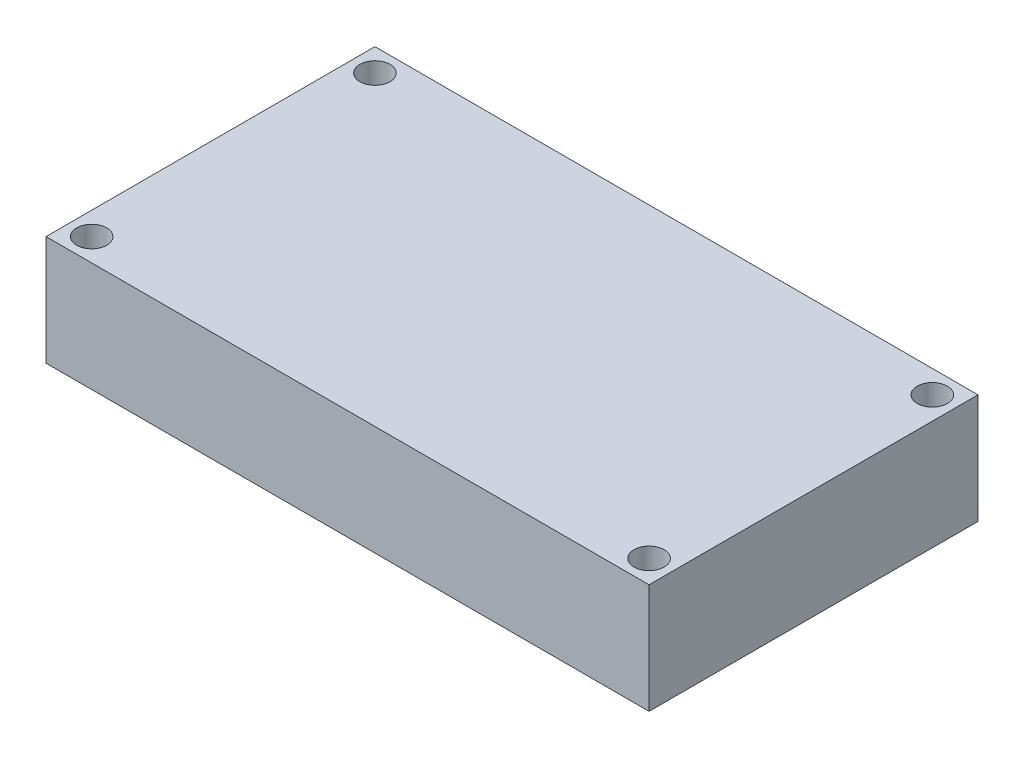
ISO-10303-21;
HEADER;
FILE_DESCRIPTION(('STEP AP214'),'2;1');
FILE_NAME('part.step','',(''),(''),'','','');
FILE_SCHEMA(('AUTOMOTIVE_DESIGN { 1 0 10303 214 1 1 1 1 }'));
ENDSEC;
DATA;
#1=APPLICATION_CONTEXT('core data for automotive mechanical design processes');
#2=APPLICATION_PROTOCOL_DEFINITION('international standard','automotive_design',2000,#1);
#3=PRODUCT_CONTEXT('',#1,'mechanical');
#4=PRODUCT('Part','Part','',(#3));
#5=PRODUCT_RELATED_PRODUCT_CATEGORY('part','',(#4));
#6=PRODUCT_DEFINITION_FORMATION('','',#4);
#7=PRODUCT_DEFINITION_CONTEXT('part definition',#1,'design');
#8=PRODUCT_DEFINITION('design','',#6,#7);
#9=PRODUCT_DEFINITION_SHAPE('','',#8);
#10=(LENGTH_UNIT() NAMED_UNIT(*) SI_UNIT(.MILLI.,.METRE.));
#11=(NAMED_UNIT(*) PLANE_ANGLE_UNIT() SI_UNIT($,.RADIAN.));
#12=(NAMED_UNIT(*) SI_UNIT($,.STERADIAN.) SOLID_ANGLE_UNIT());
#13=UNCERTAINTY_MEASURE_WITH_UNIT(LENGTH_MEASURE(1.E-05),#10,'distance_accuracy_value','');
#14=(GEOMETRIC_REPRESENTATION_CONTEXT(3) GLOBAL_UNCERTAINTY_ASSIGNED_CONTEXT((#13)) GLOBAL_UNIT_ASSIGNED_CONTEXT((#10,
#11,#12)) REPRESENTATION_CONTEXT('',''));
#15=CARTESIAN_POINT('',(0.,0.,0.));
#16=DIRECTION('',(0.,0.,1.));
#17=DIRECTION('',(1.,0.,0.));
#18=AXIS2_PLACEMENT_3D('',#15,#16,#17);
#19=CARTESIAN_POINT('',(0.,27.,0.));
#20=DIRECTION('',(0.,-1.,0.));
#21=DIRECTION('',(0.,0.,-1.));
#22=AXIS2_PLACEMENT_3D('',#19,#20,#21);
#23=PLANE('',#22);
#24=DIRECTION('',(0.,0.,-1.));
#25=VECTOR('',#24,1.);
#26=CARTESIAN_POINT('',(88.5,27.,73.5));
#27=LINE('',#26,#25);
#28=CARTESIAN_POINT('',(88.5,27.,73.5));
#29=VERTEX_POINT('',#28);
#30=CARTESIAN_POINT('',(88.5,27.,37.5));
#31=VERTEX_POINT('',#30);
#32=EDGE_CURVE('E95',#29,#31,#27,.T.);
#33=ORIENTED_EDGE('',*,*,#32,.T.);
#34=DIRECTION('',(-1.,0.,0.));
#35=VECTOR('',#34,1.);
#36=CARTESIAN_POINT('',(22.5,27.,37.5));
#37=LINE('',#36,#35);
#38=CARTESIAN_POINT('',(22.5,27.,37.5));
#39=VERTEX_POINT('',#38);
#40=EDGE_CURVE('E90',#31,#39,#37,.T.);
#41=ORIENTED_EDGE('',*,*,#40,.T.);
#42=DIRECTION('',(0.,0.,1.));
#43=VECTOR('',#42,1.);
#44=CARTESIAN_POINT('',(22.5,27.,73.5));
#45=LINE('',#44,#43);
#46=CARTESIAN_POINT('',(22.5,27.,73.5));
#47=VERTEX_POINT('',#46);
#48=EDGE_CURVE('E93',#39,#47,#45,.T.);
#49=ORIENTED_EDGE('',*,*,#48,.T.);
#50=DIRECTION('',(1.,0.,0.));
#51=VECTOR('',#50,1.);
#52=CARTESIAN_POINT('',(22.5,27.,73.5));
#53=LINE('',#52,#51);
#54=EDGE_CURVE('E60',#47,#29,#53,.T.);
#55=ORIENTED_EDGE('',*,*,#54,.T.);
#56=EDGE_LOOP('',(#33,#41,#49,#55));
#57=FACE_BOUND('',#56,.T.);
#58=CARTESIAN_POINT('',(25.,27.,40.));
#59=DIRECTION('',(0.,1.,0.));
#60=DIRECTION('',(0.,0.,1.));
#61=AXIS2_PLACEMENT_3D('',#58,#59,#60);
#62=CIRCLE('',#61,1.65);
#63=CARTESIAN_POINT('',(25.,27.,41.65));
#64=VERTEX_POINT('',#63);
#65=EDGE_CURVE('E110',#64,#64,#62,.T.);
#66=ORIENTED_EDGE('',*,*,#65,.F.);
#67=EDGE_LOOP('',(#66));
#68=FACE_BOUND('',#67,.T.);
#69=CARTESIAN_POINT('',(86.,27.,40.));
#70=DIRECTION('',(0.,1.,0.));
#71=DIRECTION('',(0.,0.,1.));
#72=AXIS2_PLACEMENT_3D('',#69,#70,#71);
#73=CIRCLE('',#72,1.65);
#74=CARTESIAN_POINT('',(86.,27.,41.65));
#75=VERTEX_POINT('',#74);
#76=EDGE_CURVE('E125',#75,#75,#73,.T.);
#77=ORIENTED_EDGE('',*,*,#76,.F.);
#78=EDGE_LOOP('',(#77));
#79=FACE_BOUND('',#78,.T.);
#80=CARTESIAN_POINT('',(86.,27.,71.));
#81=DIRECTION('',(0.,1.,0.));
#82=DIRECTION('',(0.,0.,1.));
#83=AXIS2_PLACEMENT_3D('',#80,#81,#82);
#84=CIRCLE('',#83,1.65);
#85=CARTESIAN_POINT('',(86.,27.,72.65));
#86=VERTEX_POINT('',#85);
#87=EDGE_CURVE('E131',#86,#86,#84,.T.);
#88=ORIENTED_EDGE('',*,*,#87,.F.);
#89=EDGE_LOOP('',(#88));
#90=FACE_BOUND('',#89,.T.);
#91=CARTESIAN_POINT('',(25.,27.,71.));
#92=DIRECTION('',(0.,1.,0.));
#93=DIRECTION('',(0.,0.,1.));
#94=AXIS2_PLACEMENT_3D('',#91,#92,#93);
#95=CIRCLE('',#94,1.65);
#96=CARTESIAN_POINT('',(25.,27.,72.65));
#97=VERTEX_POINT('',#96);
#98=EDGE_CURVE('E137',#97,#97,#95,.T.);
#99=ORIENTED_EDGE('',*,*,#98,.F.);
#100=EDGE_LOOP('',(#99));
#101=FACE_BOUND('',#100,.T.);
#102=ADVANCED_FACE('F43',(#57,#68,#79,#90,#101),#23,.F.);
#103=CARTESIAN_POINT('',(0.,15.,0.));
#104=DIRECTION('',(0.,-1.,0.));
#105=DIRECTION('',(0.,0.,-1.));
#106=AXIS2_PLACEMENT_3D('',#103,#104,#105);
#107=PLANE('',#106);
#108=CARTESIAN_POINT('',(86.,15.,71.));
#109=DIRECTION('',(0.,1.,0.));
#110=DIRECTION('',(0.,0.,1.));
#111=AXIS2_PLACEMENT_3D('',#108,#109,#110);
#112=CIRCLE('',#111,1.65);
#113=CARTESIAN_POINT('',(86.,15.,72.65));
#114=VERTEX_POINT('',#113);
#115=EDGE_CURVE('E134',#114,#114,#112,.T.);
#116=ORIENTED_EDGE('',*,*,#115,.T.);
#117=EDGE_LOOP('',(#116));
#118=FACE_BOUND('',#117,.T.);
#119=CARTESIAN_POINT('',(25.,15.,40.));
#120=DIRECTION('',(0.,1.,0.));
#121=DIRECTION('',(0.,0.,1.));
#122=AXIS2_PLACEMENT_3D('',#119,#120,#121);
#123=CIRCLE('',#122,1.65);
#124=CARTESIAN_POINT('',(25.,15.,41.65));
#125=VERTEX_POINT('',#124);
#126=EDGE_CURVE('E122',#125,#125,#123,.T.);
#127=ORIENTED_EDGE('',*,*,#126,.T.);
#128=EDGE_LOOP('',(#127));
#129=FACE_BOUND('',#128,.T.);
#130=DIRECTION('',(0.,0.,-1.));
#131=VECTOR('',#130,1.);
#132=CARTESIAN_POINT('',(88.5,15.,73.5));
#133=LINE('',#132,#131);
#134=CARTESIAN_POINT('',(88.5,15.,73.5));
#135=VERTEX_POINT('',#134);
#136=CARTESIAN_POINT('',(88.5,15.,37.5));
#137=VERTEX_POINT('',#136);
#138=EDGE_CURVE('E107',#135,#137,#133,.T.);
#139=ORIENTED_EDGE('',*,*,#138,.F.);
#140=DIRECTION('',(1.,0.,0.));
#141=VECTOR('',#140,1.);
#142=CARTESIAN_POINT('',(22.5,15.,73.5));
#143=LINE('',#142,#141);
#144=CARTESIAN_POINT('',(22.5,15.,73.5));
#145=VERTEX_POINT('',#144);
#146=EDGE_CURVE('E83',#145,#135,#143,.T.);
#147=ORIENTED_EDGE('',*,*,#146,.F.);
#148=DIRECTION('',(0.,0.,1.));
#149=VECTOR('',#148,1.);
#150=CARTESIAN_POINT('',(22.5,15.,73.5));
#151=LINE('',#150,#149);
#152=CARTESIAN_POINT('',(22.5,15.,37.5));
#153=VERTEX_POINT('',#152);
#154=EDGE_CURVE('E77',#153,#145,#151,.T.);
#155=ORIENTED_EDGE('',*,*,#154,.F.);
#156=DIRECTION('',(-1.,0.,0.));
#157=VECTOR('',#156,1.);
#158=CARTESIAN_POINT('',(22.5,15.,37.5));
#159=LINE('',#158,#157);
#160=EDGE_CURVE('E99',#137,#153,#159,.T.);
#161=ORIENTED_EDGE('',*,*,#160,.F.);
#162=EDGE_LOOP('',(#139,#147,#155,#161));
#163=FACE_BOUND('',#162,.T.);
#164=CARTESIAN_POINT('',(86.,15.,40.));
#165=DIRECTION('',(0.,1.,0.));
#166=DIRECTION('',(0.,0.,1.));
#167=AXIS2_PLACEMENT_3D('',#164,#165,#166);
#168=CIRCLE('',#167,1.65);
#169=CARTESIAN_POINT('',(86.,15.,41.65));
#170=VERTEX_POINT('',#169);
#171=EDGE_CURVE('E128',#170,#170,#168,.T.);
#172=ORIENTED_EDGE('',*,*,#171,.T.);
#173=EDGE_LOOP('',(#172));
#174=FACE_BOUND('',#173,.T.);
#175=CARTESIAN_POINT('',(25.,15.,71.));
#176=DIRECTION('',(0.,1.,0.));
#177=DIRECTION('',(0.,0.,1.));
#178=AXIS2_PLACEMENT_3D('',#175,#176,#177);
#179=CIRCLE('',#178,1.65);
#180=CARTESIAN_POINT('',(25.,15.,72.65));
#181=VERTEX_POINT('',#180);
#182=EDGE_CURVE('E140',#181,#181,#179,.T.);
#183=ORIENTED_EDGE('',*,*,#182,.T.);
#184=EDGE_LOOP('',(#183));
#185=FACE_BOUND('',#184,.T.);
#186=ADVANCED_FACE('F118',(#118,#129,#163,#174,#185),#107,.T.);
#187=CARTESIAN_POINT('',(88.5,27.,73.5));
#188=DIRECTION('',(-1.,0.,0.));
#189=DIRECTION('',(0.,0.,1.));
#190=AXIS2_PLACEMENT_3D('',#187,#188,#189);
#191=PLANE('',#190);
#192=ORIENTED_EDGE('',*,*,#138,.T.);
#193=DIRECTION('',(0.,-1.,0.));
#194=VECTOR('',#193,1.);
#195=CARTESIAN_POINT('',(88.5,27.,37.5));
#196=LINE('',#195,#194);
#197=EDGE_CURVE('E11',#31,#137,#196,.T.);
#198=ORIENTED_EDGE('',*,*,#197,.F.);
#199=ORIENTED_EDGE('',*,*,#32,.F.);
#200=DIRECTION('',(0.,-1.,0.));
#201=VECTOR('',#200,1.);
#202=CARTESIAN_POINT('',(88.5,27.,73.5));
#203=LINE('',#202,#201);
#204=EDGE_CURVE('E103',#29,#135,#203,.T.);
#205=ORIENTED_EDGE('',*,*,#204,.T.);
#206=EDGE_LOOP('',(#192,#198,#199,#205));
#207=FACE_BOUND('',#206,.T.);
#208=ADVANCED_FACE('F45',(#207),#191,.F.);
#209=CARTESIAN_POINT('',(22.5,27.,37.5));
#210=DIRECTION('',(0.,0.,1.));
#211=DIRECTION('',(1.,0.,0.));
#212=AXIS2_PLACEMENT_3D('',#209,#210,#211);
#213=PLANE('',#212);
#214=ORIENTED_EDGE('',*,*,#160,.T.);
#215=DIRECTION('',(0.,-1.,0.));
#216=VECTOR('',#215,1.);
#217=CARTESIAN_POINT('',(22.5,27.,37.5));
#218=LINE('',#217,#216);
#219=EDGE_CURVE('E52',#39,#153,#218,.T.);
#220=ORIENTED_EDGE('',*,*,#219,.F.);
#221=ORIENTED_EDGE('',*,*,#40,.F.);
#222=ORIENTED_EDGE('',*,*,#197,.T.);
#223=EDGE_LOOP('',(#214,#220,#221,#222));
#224=FACE_BOUND('',#223,.T.);
#225=ADVANCED_FACE('F98',(#224),#213,.F.);
#226=CARTESIAN_POINT('',(22.5,27.,73.5));
#227=DIRECTION('',(1.,0.,0.));
#228=DIRECTION('',(0.,0.,-1.));
#229=AXIS2_PLACEMENT_3D('',#226,#227,#228);
#230=PLANE('',#229);
#231=ORIENTED_EDGE('',*,*,#154,.T.);
#232=DIRECTION('',(0.,-1.,0.));
#233=VECTOR('',#232,1.);
#234=CARTESIAN_POINT('',(22.5,27.,73.5));
#235=LINE('',#234,#233);
#236=EDGE_CURVE('E100',#47,#145,#235,.T.);
#237=ORIENTED_EDGE('',*,*,#236,.F.);
#238=ORIENTED_EDGE('',*,*,#48,.F.);
#239=ORIENTED_EDGE('',*,*,#219,.T.);
#240=EDGE_LOOP('',(#231,#237,#238,#239));
#241=FACE_BOUND('',#240,.T.);
#242=ADVANCED_FACE('F101',(#241),#230,.F.);
#243=CARTESIAN_POINT('',(22.5,27.,73.5));
#244=DIRECTION('',(0.,0.,-1.));
#245=DIRECTION('',(-1.,0.,0.));
#246=AXIS2_PLACEMENT_3D('',#243,#244,#245);
#247=PLANE('',#246);
#248=ORIENTED_EDGE('',*,*,#146,.T.);
#249=ORIENTED_EDGE('',*,*,#204,.F.);
#250=ORIENTED_EDGE('',*,*,#54,.F.);
#251=ORIENTED_EDGE('',*,*,#236,.T.);
#252=EDGE_LOOP('',(#248,#249,#250,#251));
#253=FACE_BOUND('',#252,.T.);
#254=ADVANCED_FACE('F115',(#253),#247,.F.);
#255=CARTESIAN_POINT('',(25.,27.,40.));
#256=DIRECTION('',(0.,-1.,0.));
#257=DIRECTION('',(0.,0.,-1.));
#258=AXIS2_PLACEMENT_3D('',#255,#256,#257);
#259=CYLINDRICAL_SURFACE('',#258,1.65);
#260=ORIENTED_EDGE('',*,*,#65,.T.);
#261=EDGE_LOOP('',(#260));
#262=FACE_BOUND('',#261,.T.);
#263=ORIENTED_EDGE('',*,*,#126,.F.);
#264=EDGE_LOOP('',(#263));
#265=FACE_BOUND('',#264,.T.);
#266=ADVANCED_FACE('F157',(#262,#265),#259,.F.);
#267=CARTESIAN_POINT('',(86.,27.,40.));
#268=DIRECTION('',(0.,-1.,0.));
#269=DIRECTION('',(0.,0.,-1.));
#270=AXIS2_PLACEMENT_3D('',#267,#268,#269);
#271=CYLINDRICAL_SURFACE('',#270,1.65);
#272=ORIENTED_EDGE('',*,*,#76,.T.);
#273=EDGE_LOOP('',(#272));
#274=FACE_BOUND('',#273,.T.);
#275=ORIENTED_EDGE('',*,*,#171,.F.);
#276=EDGE_LOOP('',(#275));
#277=FACE_BOUND('',#276,.T.);
#278=ADVANCED_FACE('F225',(#274,#277),#271,.F.);
#279=CARTESIAN_POINT('',(86.,27.,71.));
#280=DIRECTION('',(0.,-1.,0.));
#281=DIRECTION('',(0.,0.,-1.));
#282=AXIS2_PLACEMENT_3D('',#279,#280,#281);
#283=CYLINDRICAL_SURFACE('',#282,1.65);
#284=ORIENTED_EDGE('',*,*,#87,.T.);
#285=EDGE_LOOP('',(#284));
#286=FACE_BOUND('',#285,.T.);
#287=ORIENTED_EDGE('',*,*,#115,.F.);
#288=EDGE_LOOP('',(#287));
#289=FACE_BOUND('',#288,.T.);
#290=ADVANCED_FACE('F236',(#286,#289),#283,.F.);
#291=CARTESIAN_POINT('',(25.,27.,71.));
#292=DIRECTION('',(0.,-1.,0.));
#293=DIRECTION('',(0.,0.,-1.));
#294=AXIS2_PLACEMENT_3D('',#291,#292,#293);
#295=CYLINDRICAL_SURFACE('',#294,1.65);
#296=ORIENTED_EDGE('',*,*,#98,.T.);
#297=EDGE_LOOP('',(#296));
#298=FACE_BOUND('',#297,.T.);
#299=ORIENTED_EDGE('',*,*,#182,.F.);
#300=EDGE_LOOP('',(#299));
#301=FACE_BOUND('',#300,.T.);
#302=ADVANCED_FACE('F146',(#298,#301),#295,.F.);
#303=CLOSED_SHELL('',(#102,#186,#208,#225,#242,#254,#266,#278,#290,#302));
#304=MANIFOLD_SOLID_BREP('B2',#303);
#305=ADVANCED_BREP_SHAPE_REPRESENTATION('',(#18,#304),#14);
#306=SHAPE_DEFINITION_REPRESENTATION(#9,#305);
ENDSEC;
END-ISO-10303-21;
